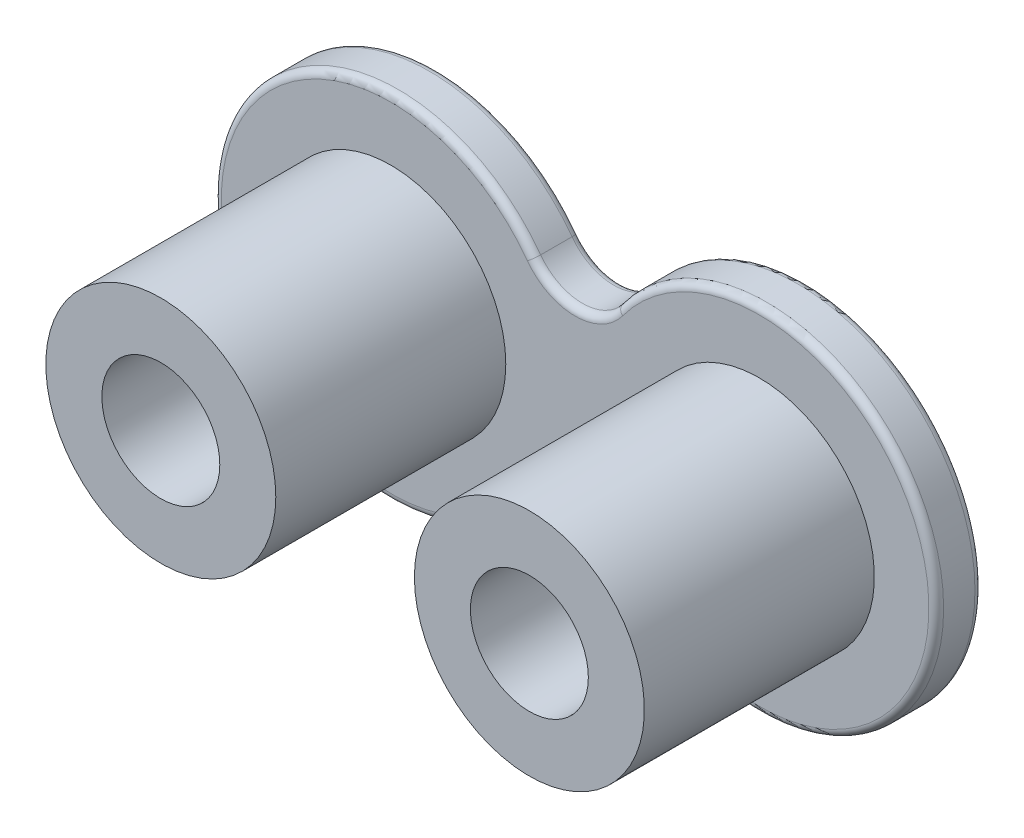
ISO-10303-21;
HEADER;
FILE_DESCRIPTION(('STEP AP214'),'2;1');
FILE_NAME('part.step','',(''),(''),'','','');
FILE_SCHEMA(('AUTOMOTIVE_DESIGN { 1 0 10303 214 1 1 1 1 }'));
ENDSEC;
DATA;
#1=APPLICATION_CONTEXT('core data for automotive mechanical design processes');
#2=APPLICATION_PROTOCOL_DEFINITION('international standard','automotive_design',2000,#1);
#3=PRODUCT_CONTEXT('',#1,'mechanical');
#4=PRODUCT('Part','Part','',(#3));
#5=PRODUCT_RELATED_PRODUCT_CATEGORY('part','',(#4));
#6=PRODUCT_DEFINITION_FORMATION('','',#4);
#7=PRODUCT_DEFINITION_CONTEXT('part definition',#1,'design');
#8=PRODUCT_DEFINITION('design','',#6,#7);
#9=PRODUCT_DEFINITION_SHAPE('','',#8);
#10=(LENGTH_UNIT() NAMED_UNIT(*) SI_UNIT(.MILLI.,.METRE.));
#11=(NAMED_UNIT(*) PLANE_ANGLE_UNIT() SI_UNIT($,.RADIAN.));
#12=(NAMED_UNIT(*) SI_UNIT($,.STERADIAN.) SOLID_ANGLE_UNIT());
#13=UNCERTAINTY_MEASURE_WITH_UNIT(LENGTH_MEASURE(1.E-05),#10,'distance_accuracy_value','');
#14=(GEOMETRIC_REPRESENTATION_CONTEXT(3) GLOBAL_UNCERTAINTY_ASSIGNED_CONTEXT((#13)) GLOBAL_UNIT_ASSIGNED_CONTEXT((#10,
#11,#12)) REPRESENTATION_CONTEXT('',''));
#15=CARTESIAN_POINT('',(0.,0.,0.));
#16=DIRECTION('',(0.,0.,1.));
#17=DIRECTION('',(1.,0.,0.));
#18=AXIS2_PLACEMENT_3D('',#15,#16,#17);
#19=CARTESIAN_POINT('',(3.175,2.33452988345001,1.5875));
#20=DIRECTION('',(0.,0.,1.));
#21=DIRECTION('',(1.,0.,0.));
#22=AXIS2_PLACEMENT_3D('',#19,#20,#21);
#23=PLANE('',#22);
#24=CARTESIAN_POINT('',(6.35,0.,1.5875));
#25=DIRECTION('',(0.,0.,1.));
#26=DIRECTION('',(-1.,0.,0.));
#27=AXIS2_PLACEMENT_3D('',#24,#25,#26);
#28=CIRCLE('',#27,3.9624);
#29=CARTESIAN_POINT('',(2.3876,0.,1.5875));
#30=VERTEX_POINT('',#29);
#31=EDGE_CURVE('E236',#30,#30,#28,.T.);
#32=ORIENTED_EDGE('',*,*,#31,.F.);
#33=EDGE_LOOP('',(#32));
#34=FACE_BOUND('',#33,.T.);
#35=CARTESIAN_POINT('',(-6.35,0.,1.5875));
#36=DIRECTION('',(0.,0.,1.));
#37=DIRECTION('',(1.,0.,0.));
#38=AXIS2_PLACEMENT_3D('',#35,#36,#37);
#39=CIRCLE('',#38,3.9624);
#40=CARTESIAN_POINT('',(-2.3876,0.,1.5875));
#41=VERTEX_POINT('',#40);
#42=EDGE_CURVE('E224',#41,#41,#39,.T.);
#43=ORIENTED_EDGE('',*,*,#42,.F.);
#44=EDGE_LOOP('',(#43));
#45=FACE_BOUND('',#44,.T.);
#46=CARTESIAN_POINT('',(0.,-4.66905976690001,1.5875));
#47=DIRECTION('',(0.,0.,1.));
#48=DIRECTION('',(1.,0.,0.));
#49=AXIS2_PLACEMENT_3D('',#46,#47,#48);
#50=CIRCLE('',#49,2.03979034908214);
#51=CARTESIAN_POINT('',(-1.64336630930306,-3.46071716579043,1.5875));
#52=VERTEX_POINT('',#51);
#53=CARTESIAN_POINT('',(1.64336630930306,-3.46071716579043,1.5875));
#54=VERTEX_POINT('',#53);
#55=EDGE_CURVE('E50',#52,#54,#50,.F.);
#56=ORIENTED_EDGE('',*,*,#55,.T.);
#57=CARTESIAN_POINT('',(6.35,0.,1.5875));
#58=DIRECTION('',(0.,0.,1.));
#59=DIRECTION('',(1.,0.,0.));
#60=AXIS2_PLACEMENT_3D('',#57,#58,#59);
#61=CIRCLE('',#60,5.842);
#62=CARTESIAN_POINT('',(1.64336630930306,3.46071716579042,1.5875));
#63=VERTEX_POINT('',#62);
#64=EDGE_CURVE('E42',#54,#63,#61,.T.);
#65=ORIENTED_EDGE('',*,*,#64,.T.);
#66=CARTESIAN_POINT('',(0.,4.66905976690001,1.5875));
#67=DIRECTION('',(0.,0.,1.));
#68=DIRECTION('',(1.,0.,0.));
#69=AXIS2_PLACEMENT_3D('',#66,#67,#68);
#70=CIRCLE('',#69,2.03979034908214);
#71=CARTESIAN_POINT('',(-1.64336630930306,3.46071716579042,1.5875));
#72=VERTEX_POINT('',#71);
#73=EDGE_CURVE('E168',#63,#72,#70,.F.);
#74=ORIENTED_EDGE('',*,*,#73,.T.);
#75=CARTESIAN_POINT('',(-6.35,0.,1.5875));
#76=DIRECTION('',(0.,0.,1.));
#77=DIRECTION('',(1.,0.,0.));
#78=AXIS2_PLACEMENT_3D('',#75,#76,#77);
#79=CIRCLE('',#78,5.842);
#80=EDGE_CURVE('E55',#72,#52,#79,.T.);
#81=ORIENTED_EDGE('',*,*,#80,.T.);
#82=EDGE_LOOP('',(#56,#65,#74,#81));
#83=FACE_BOUND('',#82,.T.);
#84=ADVANCED_FACE('F33',(#34,#45,#83),#23,.T.);
#85=CARTESIAN_POINT('',(3.175,2.33452988345001,0.));
#86=DIRECTION('',(0.,0.,1.));
#87=DIRECTION('',(1.,0.,0.));
#88=AXIS2_PLACEMENT_3D('',#85,#86,#87);
#89=PLANE('',#88);
#90=CARTESIAN_POINT('',(6.35,0.,0.));
#91=DIRECTION('',(0.,0.,1.));
#92=DIRECTION('',(1.,0.,0.));
#93=AXIS2_PLACEMENT_3D('',#90,#91,#92);
#94=CIRCLE('',#93,2.286);
#95=CARTESIAN_POINT('',(8.636,0.,0.));
#96=VERTEX_POINT('',#95);
#97=EDGE_CURVE('E130',#96,#96,#94,.T.);
#98=ORIENTED_EDGE('',*,*,#97,.T.);
#99=EDGE_LOOP('',(#98));
#100=FACE_BOUND('',#99,.T.);
#101=CARTESIAN_POINT('',(-6.35,0.,0.));
#102=DIRECTION('',(0.,0.,1.));
#103=DIRECTION('',(1.,0.,0.));
#104=AXIS2_PLACEMENT_3D('',#101,#102,#103);
#105=CIRCLE('',#104,2.286);
#106=CARTESIAN_POINT('',(-4.064,0.,0.));
#107=VERTEX_POINT('',#106);
#108=EDGE_CURVE('E127',#107,#107,#105,.T.);
#109=ORIENTED_EDGE('',*,*,#108,.T.);
#110=EDGE_LOOP('',(#109));
#111=FACE_BOUND('',#110,.T.);
#112=CARTESIAN_POINT('',(0.,-4.66905976690001,0.));
#113=DIRECTION('',(0.,0.,1.));
#114=DIRECTION('',(1.,0.,0.));
#115=AXIS2_PLACEMENT_3D('',#112,#113,#114);
#116=CIRCLE('',#115,2.03979034908214);
#117=CARTESIAN_POINT('',(1.64336630930306,-3.46071716579043,0.));
#118=VERTEX_POINT('',#117);
#119=CARTESIAN_POINT('',(-1.64336630930306,-3.46071716579043,0.));
#120=VERTEX_POINT('',#119);
#121=EDGE_CURVE('E126',#118,#120,#116,.T.);
#122=ORIENTED_EDGE('',*,*,#121,.T.);
#123=CARTESIAN_POINT('',(-6.35,0.,0.));
#124=DIRECTION('',(0.,0.,1.));
#125=DIRECTION('',(1.,0.,0.));
#126=AXIS2_PLACEMENT_3D('',#123,#124,#125);
#127=CIRCLE('',#126,5.842);
#128=CARTESIAN_POINT('',(-1.64336630930306,3.46071716579042,0.));
#129=VERTEX_POINT('',#128);
#130=EDGE_CURVE('E105',#120,#129,#127,.F.);
#131=ORIENTED_EDGE('',*,*,#130,.T.);
#132=CARTESIAN_POINT('',(0.,4.66905976690001,0.));
#133=DIRECTION('',(0.,0.,1.));
#134=DIRECTION('',(1.,0.,0.));
#135=AXIS2_PLACEMENT_3D('',#132,#133,#134);
#136=CIRCLE('',#135,2.03979034908214);
#137=CARTESIAN_POINT('',(1.64336630930306,3.46071716579042,0.));
#138=VERTEX_POINT('',#137);
#139=EDGE_CURVE('E115',#129,#138,#136,.T.);
#140=ORIENTED_EDGE('',*,*,#139,.T.);
#141=CARTESIAN_POINT('',(6.35,0.,0.));
#142=DIRECTION('',(0.,0.,1.));
#143=DIRECTION('',(1.,0.,0.));
#144=AXIS2_PLACEMENT_3D('',#141,#142,#143);
#145=CIRCLE('',#144,5.842);
#146=EDGE_CURVE('E121',#138,#118,#145,.F.);
#147=ORIENTED_EDGE('',*,*,#146,.T.);
#148=EDGE_LOOP('',(#122,#131,#140,#147));
#149=FACE_BOUND('',#148,.T.);
#150=ADVANCED_FACE('F124',(#100,#111,#149),#89,.F.);
#151=CARTESIAN_POINT('',(0.,4.66905976690001,1.5875));
#152=DIRECTION('',(0.,0.,-1.));
#153=DIRECTION('',(-1.,0.,0.));
#154=AXIS2_PLACEMENT_3D('',#151,#152,#153);
#155=CYLINDRICAL_SURFACE('',#154,1.78579034908214);
#156=DIRECTION('',(0.,0.,-1.));
#157=VECTOR('',#156,1.);
#158=CARTESIAN_POINT('',(1.43873006188146,3.61118312952044,1.5875));
#159=LINE('',#158,#157);
#160=CARTESIAN_POINT('',(1.43873006188146,3.61118312952044,1.3335));
#161=VERTEX_POINT('',#160);
#162=CARTESIAN_POINT('',(1.43873006188146,3.61118312952044,0.254));
#163=VERTEX_POINT('',#162);
#164=EDGE_CURVE('E177',#161,#163,#159,.T.);
#165=ORIENTED_EDGE('',*,*,#164,.T.);
#166=CARTESIAN_POINT('',(0.,4.66905976690001,0.254));
#167=DIRECTION('',(0.,0.,1.));
#168=DIRECTION('',(1.,0.,0.));
#169=AXIS2_PLACEMENT_3D('',#166,#167,#168);
#170=CIRCLE('',#169,1.78579034908214);
#171=CARTESIAN_POINT('',(-1.43873006188146,3.61118312952044,0.254));
#172=VERTEX_POINT('',#171);
#173=EDGE_CURVE('E163',#163,#172,#170,.F.);
#174=ORIENTED_EDGE('',*,*,#173,.T.);
#175=DIRECTION('',(0.,0.,-1.));
#176=VECTOR('',#175,1.);
#177=CARTESIAN_POINT('',(-1.43873006188146,3.61118312952044,1.5875));
#178=LINE('',#177,#176);
#179=CARTESIAN_POINT('',(-1.43873006188146,3.61118312952044,1.3335));
#180=VERTEX_POINT('',#179);
#181=EDGE_CURVE('E122',#180,#172,#178,.T.);
#182=ORIENTED_EDGE('',*,*,#181,.F.);
#183=CARTESIAN_POINT('',(0.,4.66905976690001,1.3335));
#184=DIRECTION('',(0.,0.,1.));
#185=DIRECTION('',(1.,0.,0.));
#186=AXIS2_PLACEMENT_3D('',#183,#184,#185);
#187=CIRCLE('',#186,1.78579034908214);
#188=EDGE_CURVE('E161',#180,#161,#187,.T.);
#189=ORIENTED_EDGE('',*,*,#188,.T.);
#190=EDGE_LOOP('',(#165,#174,#182,#189));
#191=FACE_BOUND('',#190,.T.);
#192=ADVANCED_FACE('F204',(#191),#155,.F.);
#193=CARTESIAN_POINT('',(-6.35,0.,1.5875));
#194=DIRECTION('',(0.,0.,-1.));
#195=DIRECTION('',(-1.,0.,0.));
#196=AXIS2_PLACEMENT_3D('',#193,#194,#195);
#197=CYLINDRICAL_SURFACE('',#196,6.096);
#198=ORIENTED_EDGE('',*,*,#181,.T.);
#199=CARTESIAN_POINT('',(-6.35,0.,0.254));
#200=DIRECTION('',(0.,0.,1.));
#201=DIRECTION('',(1.,0.,0.));
#202=AXIS2_PLACEMENT_3D('',#199,#200,#201);
#203=CIRCLE('',#202,6.096);
#204=CARTESIAN_POINT('',(-1.43873006188146,-3.61118312952044,0.254));
#205=VERTEX_POINT('',#204);
#206=EDGE_CURVE('E108',#172,#205,#203,.T.);
#207=ORIENTED_EDGE('',*,*,#206,.T.);
#208=DIRECTION('',(0.,0.,-1.));
#209=VECTOR('',#208,1.);
#210=CARTESIAN_POINT('',(-1.43873006188146,-3.61118312952044,1.5875));
#211=LINE('',#210,#209);
#212=CARTESIAN_POINT('',(-1.43873006188146,-3.61118312952044,1.3335));
#213=VERTEX_POINT('',#212);
#214=EDGE_CURVE('E201',#213,#205,#211,.T.);
#215=ORIENTED_EDGE('',*,*,#214,.F.);
#216=CARTESIAN_POINT('',(-6.35,0.,1.3335));
#217=DIRECTION('',(0.,0.,1.));
#218=DIRECTION('',(1.,0.,0.));
#219=AXIS2_PLACEMENT_3D('',#216,#217,#218);
#220=CIRCLE('',#219,6.096);
#221=EDGE_CURVE('E149',#213,#180,#220,.F.);
#222=ORIENTED_EDGE('',*,*,#221,.T.);
#223=EDGE_LOOP('',(#198,#207,#215,#222));
#224=FACE_BOUND('',#223,.T.);
#225=ADVANCED_FACE('F199',(#224),#197,.T.);
#226=CARTESIAN_POINT('',(0.,-4.66905976690001,1.5875));
#227=DIRECTION('',(0.,0.,-1.));
#228=DIRECTION('',(-1.,0.,0.));
#229=AXIS2_PLACEMENT_3D('',#226,#227,#228);
#230=CYLINDRICAL_SURFACE('',#229,1.78579034908214);
#231=ORIENTED_EDGE('',*,*,#214,.T.);
#232=CARTESIAN_POINT('',(0.,-4.66905976690001,0.254));
#233=DIRECTION('',(0.,0.,1.));
#234=DIRECTION('',(1.,0.,0.));
#235=AXIS2_PLACEMENT_3D('',#232,#233,#234);
#236=CIRCLE('',#235,1.78579034908214);
#237=CARTESIAN_POINT('',(1.43873006188146,-3.61118312952044,0.254));
#238=VERTEX_POINT('',#237);
#239=EDGE_CURVE('E154',#205,#238,#236,.F.);
#240=ORIENTED_EDGE('',*,*,#239,.T.);
#241=DIRECTION('',(0.,0.,-1.));
#242=VECTOR('',#241,1.);
#243=CARTESIAN_POINT('',(1.43873006188146,-3.61118312952044,1.5875));
#244=LINE('',#243,#242);
#245=CARTESIAN_POINT('',(1.43873006188146,-3.61118312952044,1.3335));
#246=VERTEX_POINT('',#245);
#247=EDGE_CURVE('E207',#246,#238,#244,.T.);
#248=ORIENTED_EDGE('',*,*,#247,.F.);
#249=CARTESIAN_POINT('',(0.,-4.66905976690001,1.3335));
#250=DIRECTION('',(0.,0.,1.));
#251=DIRECTION('',(1.,0.,0.));
#252=AXIS2_PLACEMENT_3D('',#249,#250,#251);
#253=CIRCLE('',#252,1.78579034908214);
#254=EDGE_CURVE('E152',#246,#213,#253,.T.);
#255=ORIENTED_EDGE('',*,*,#254,.T.);
#256=EDGE_LOOP('',(#231,#240,#248,#255));
#257=FACE_BOUND('',#256,.T.);
#258=ADVANCED_FACE('F220',(#257),#230,.F.);
#259=CARTESIAN_POINT('',(6.35,0.,1.5875));
#260=DIRECTION('',(0.,0.,-1.));
#261=DIRECTION('',(-1.,0.,0.));
#262=AXIS2_PLACEMENT_3D('',#259,#260,#261);
#263=CYLINDRICAL_SURFACE('',#262,6.096);
#264=ORIENTED_EDGE('',*,*,#247,.T.);
#265=CARTESIAN_POINT('',(6.35,0.,0.254));
#266=DIRECTION('',(0.,0.,1.));
#267=DIRECTION('',(1.,0.,0.));
#268=AXIS2_PLACEMENT_3D('',#265,#266,#267);
#269=CIRCLE('',#268,6.096);
#270=EDGE_CURVE('E159',#238,#163,#269,.T.);
#271=ORIENTED_EDGE('',*,*,#270,.T.);
#272=ORIENTED_EDGE('',*,*,#164,.F.);
#273=CARTESIAN_POINT('',(6.35,0.,1.3335));
#274=DIRECTION('',(0.,0.,1.));
#275=DIRECTION('',(1.,0.,0.));
#276=AXIS2_PLACEMENT_3D('',#273,#274,#275);
#277=CIRCLE('',#276,6.096);
#278=EDGE_CURVE('E156',#161,#246,#277,.F.);
#279=ORIENTED_EDGE('',*,*,#278,.T.);
#280=EDGE_LOOP('',(#264,#271,#272,#279));
#281=FACE_BOUND('',#280,.T.);
#282=ADVANCED_FACE('F281',(#281),#263,.T.);
#283=CARTESIAN_POINT('',(-6.35,0.,1.5875));
#284=DIRECTION('',(0.,0.,-1.));
#285=DIRECTION('',(-1.,0.,0.));
#286=AXIS2_PLACEMENT_3D('',#283,#284,#285);
#287=CYLINDRICAL_SURFACE('',#286,2.032);
#288=CARTESIAN_POINT('',(-6.35,0.,0.254));
#289=DIRECTION('',(0.,0.,1.));
#290=DIRECTION('',(1.,0.,0.));
#291=AXIS2_PLACEMENT_3D('',#288,#289,#290);
#292=CIRCLE('',#291,2.032);
#293=CARTESIAN_POINT('',(-4.318,0.,0.254));
#294=VERTEX_POINT('',#293);
#295=EDGE_CURVE('E146',#294,#294,#292,.F.);
#296=ORIENTED_EDGE('',*,*,#295,.T.);
#297=EDGE_LOOP('',(#296));
#298=FACE_BOUND('',#297,.T.);
#299=CARTESIAN_POINT('',(-6.35,0.,1.3335));
#300=DIRECTION('',(0.,0.,1.));
#301=DIRECTION('',(1.,0.,0.));
#302=AXIS2_PLACEMENT_3D('',#299,#300,#301);
#303=CIRCLE('',#302,2.032);
#304=CARTESIAN_POINT('',(-4.318,0.,1.3335));
#305=VERTEX_POINT('',#304);
#306=EDGE_CURVE('E143',#305,#305,#303,.T.);
#307=ORIENTED_EDGE('',*,*,#306,.T.);
#308=EDGE_LOOP('',(#307));
#309=FACE_BOUND('',#308,.T.);
#310=ADVANCED_FACE('F278',(#298,#309),#287,.F.);
#311=CARTESIAN_POINT('',(6.35,0.,1.5875));
#312=DIRECTION('',(0.,0.,-1.));
#313=DIRECTION('',(-1.,0.,0.));
#314=AXIS2_PLACEMENT_3D('',#311,#312,#313);
#315=CYLINDRICAL_SURFACE('',#314,2.032);
#316=CARTESIAN_POINT('',(6.35,0.,0.254));
#317=DIRECTION('',(0.,0.,1.));
#318=DIRECTION('',(1.,0.,0.));
#319=AXIS2_PLACEMENT_3D('',#316,#317,#318);
#320=CIRCLE('',#319,2.032);
#321=CARTESIAN_POINT('',(8.382,0.,0.254));
#322=VERTEX_POINT('',#321);
#323=EDGE_CURVE('E140',#322,#322,#320,.F.);
#324=ORIENTED_EDGE('',*,*,#323,.T.);
#325=EDGE_LOOP('',(#324));
#326=FACE_BOUND('',#325,.T.);
#327=CARTESIAN_POINT('',(6.35,0.,1.3335));
#328=DIRECTION('',(0.,0.,1.));
#329=DIRECTION('',(1.,0.,0.));
#330=AXIS2_PLACEMENT_3D('',#327,#328,#329);
#331=CIRCLE('',#330,2.032);
#332=CARTESIAN_POINT('',(8.382,0.,1.3335));
#333=VERTEX_POINT('',#332);
#334=EDGE_CURVE('E137',#333,#333,#331,.T.);
#335=ORIENTED_EDGE('',*,*,#334,.T.);
#336=EDGE_LOOP('',(#335));
#337=FACE_BOUND('',#336,.T.);
#338=ADVANCED_FACE('F294',(#326,#337),#315,.F.);
#339=CARTESIAN_POINT('',(6.35,0.,0.254));
#340=DIRECTION('',(0.,0.,1.));
#341=DIRECTION('',(1.,0.,0.));
#342=AXIS2_PLACEMENT_3D('',#339,#340,#341);
#343=TOROIDAL_SURFACE('',#342,2.286,0.254);
#344=ORIENTED_EDGE('',*,*,#323,.F.);
#345=EDGE_LOOP('',(#344));
#346=FACE_BOUND('',#345,.T.);
#347=ORIENTED_EDGE('',*,*,#97,.F.);
#348=EDGE_LOOP('',(#347));
#349=FACE_BOUND('',#348,.T.);
#350=ADVANCED_FACE('F290',(#346,#349),#343,.T.);
#351=CARTESIAN_POINT('',(-6.35,0.,0.254));
#352=DIRECTION('',(0.,0.,1.));
#353=DIRECTION('',(1.,0.,0.));
#354=AXIS2_PLACEMENT_3D('',#351,#352,#353);
#355=TOROIDAL_SURFACE('',#354,2.286,0.254);
#356=ORIENTED_EDGE('',*,*,#295,.F.);
#357=EDGE_LOOP('',(#356));
#358=FACE_BOUND('',#357,.T.);
#359=ORIENTED_EDGE('',*,*,#108,.F.);
#360=EDGE_LOOP('',(#359));
#361=FACE_BOUND('',#360,.T.);
#362=ADVANCED_FACE('F293',(#358,#361),#355,.T.);
#363=CARTESIAN_POINT('',(6.35,0.,0.254));
#364=DIRECTION('',(0.,0.,1.));
#365=DIRECTION('',(1.,0.,0.));
#366=AXIS2_PLACEMENT_3D('',#363,#364,#365);
#367=TOROIDAL_SURFACE('',#366,5.842,0.254);
#368=CARTESIAN_POINT('',(1.64336630930306,-3.46071716579043,0.254));
#369=DIRECTION('',(-0.59238568397645,0.805654517407898,0.));
#370=DIRECTION('',(-0.805654517407898,-0.59238568397645,0.));
#371=AXIS2_PLACEMENT_3D('',#368,#369,#370);
#372=CIRCLE('',#371,0.254);
#373=EDGE_CURVE('E111',#118,#238,#372,.T.);
#374=ORIENTED_EDGE('',*,*,#373,.F.);
#375=ORIENTED_EDGE('',*,*,#146,.F.);
#376=CARTESIAN_POINT('',(1.64336630930306,3.46071716579042,0.254));
#377=DIRECTION('',(-0.59238568397645,-0.805654517407898,0.));
#378=DIRECTION('',(0.805654517407898,-0.59238568397645,0.));
#379=AXIS2_PLACEMENT_3D('',#376,#377,#378);
#380=CIRCLE('',#379,0.254);
#381=EDGE_CURVE('E118',#163,#138,#380,.T.);
#382=ORIENTED_EDGE('',*,*,#381,.F.);
#383=ORIENTED_EDGE('',*,*,#270,.F.);
#384=EDGE_LOOP('',(#374,#375,#382,#383));
#385=FACE_BOUND('',#384,.T.);
#386=ADVANCED_FACE('F213',(#385),#367,.T.);
#387=CARTESIAN_POINT('',(0.,4.66905976690001,0.254));
#388=DIRECTION('',(0.,0.,1.));
#389=DIRECTION('',(1.,0.,0.));
#390=AXIS2_PLACEMENT_3D('',#387,#388,#389);
#391=TOROIDAL_SURFACE('',#390,2.03979034908214,0.254);
#392=ORIENTED_EDGE('',*,*,#381,.T.);
#393=ORIENTED_EDGE('',*,*,#139,.F.);
#394=CARTESIAN_POINT('',(-1.64336630930306,3.46071716579042,0.254));
#395=DIRECTION('',(-0.59238568397645,0.805654517407898,0.));
#396=DIRECTION('',(-0.805654517407898,-0.59238568397645,0.));
#397=AXIS2_PLACEMENT_3D('',#394,#395,#396);
#398=CIRCLE('',#397,0.254);
#399=EDGE_CURVE('E101',#172,#129,#398,.T.);
#400=ORIENTED_EDGE('',*,*,#399,.F.);
#401=ORIENTED_EDGE('',*,*,#173,.F.);
#402=EDGE_LOOP('',(#392,#393,#400,#401));
#403=FACE_BOUND('',#402,.T.);
#404=ADVANCED_FACE('F116',(#403),#391,.T.);
#405=CARTESIAN_POINT('',(0.,-4.66905976690001,0.254));
#406=DIRECTION('',(0.,0.,1.));
#407=DIRECTION('',(1.,0.,0.));
#408=AXIS2_PLACEMENT_3D('',#405,#406,#407);
#409=TOROIDAL_SURFACE('',#408,2.03979034908214,0.254);
#410=ORIENTED_EDGE('',*,*,#373,.T.);
#411=ORIENTED_EDGE('',*,*,#239,.F.);
#412=CARTESIAN_POINT('',(-1.64336630930306,-3.46071716579043,0.254));
#413=DIRECTION('',(-0.59238568397645,-0.805654517407898,0.));
#414=DIRECTION('',(0.805654517407898,-0.59238568397645,0.));
#415=AXIS2_PLACEMENT_3D('',#412,#413,#414);
#416=CIRCLE('',#415,0.254);
#417=EDGE_CURVE('E112',#120,#205,#416,.T.);
#418=ORIENTED_EDGE('',*,*,#417,.F.);
#419=ORIENTED_EDGE('',*,*,#121,.F.);
#420=EDGE_LOOP('',(#410,#411,#418,#419));
#421=FACE_BOUND('',#420,.T.);
#422=ADVANCED_FACE('F216',(#421),#409,.T.);
#423=CARTESIAN_POINT('',(-6.35,0.,0.254));
#424=DIRECTION('',(0.,0.,1.));
#425=DIRECTION('',(1.,0.,0.));
#426=AXIS2_PLACEMENT_3D('',#423,#424,#425);
#427=TOROIDAL_SURFACE('',#426,5.842,0.254);
#428=ORIENTED_EDGE('',*,*,#399,.T.);
#429=ORIENTED_EDGE('',*,*,#130,.F.);
#430=ORIENTED_EDGE('',*,*,#417,.T.);
#431=ORIENTED_EDGE('',*,*,#206,.F.);
#432=EDGE_LOOP('',(#428,#429,#430,#431));
#433=FACE_BOUND('',#432,.T.);
#434=ADVANCED_FACE('F103',(#433),#427,.T.);
#435=CARTESIAN_POINT('',(6.35,0.,1.3335));
#436=DIRECTION('',(0.,0.,1.));
#437=DIRECTION('',(1.,0.,0.));
#438=AXIS2_PLACEMENT_3D('',#435,#436,#437);
#439=TOROIDAL_SURFACE('',#438,2.286,0.254);
#440=CARTESIAN_POINT('',(6.35,0.,1.5875));
#441=DIRECTION('',(0.,0.,1.));
#442=DIRECTION('',(1.,0.,0.));
#443=AXIS2_PLACEMENT_3D('',#440,#441,#442);
#444=CIRCLE('',#443,2.286);
#445=CARTESIAN_POINT('',(8.636,0.,1.5875));
#446=VERTEX_POINT('',#445);
#447=EDGE_CURVE('E11',#446,#446,#444,.F.);
#448=ORIENTED_EDGE('',*,*,#447,.F.);
#449=EDGE_LOOP('',(#448));
#450=FACE_BOUND('',#449,.T.);
#451=ORIENTED_EDGE('',*,*,#334,.F.);
#452=EDGE_LOOP('',(#451));
#453=FACE_BOUND('',#452,.T.);
#454=ADVANCED_FACE('F301',(#450,#453),#439,.T.);
#455=CARTESIAN_POINT('',(-6.35,0.,1.3335));
#456=DIRECTION('',(0.,0.,1.));
#457=DIRECTION('',(1.,0.,0.));
#458=AXIS2_PLACEMENT_3D('',#455,#456,#457);
#459=TOROIDAL_SURFACE('',#458,5.842,0.254);
#460=CARTESIAN_POINT('',(-1.64336630930306,3.46071716579042,1.3335));
#461=DIRECTION('',(0.59238568397645,-0.805654517407898,0.));
#462=DIRECTION('',(0.805654517407898,0.59238568397645,0.));
#463=AXIS2_PLACEMENT_3D('',#460,#461,#462);
#464=CIRCLE('',#463,0.254);
#465=EDGE_CURVE('E182',#180,#72,#464,.T.);
#466=ORIENTED_EDGE('',*,*,#465,.F.);
#467=ORIENTED_EDGE('',*,*,#221,.F.);
#468=CARTESIAN_POINT('',(-1.64336630930306,-3.46071716579043,1.3335));
#469=DIRECTION('',(0.59238568397645,0.805654517407898,0.));
#470=DIRECTION('',(-0.805654517407898,0.59238568397645,0.));
#471=AXIS2_PLACEMENT_3D('',#468,#469,#470);
#472=CIRCLE('',#471,0.254);
#473=EDGE_CURVE('E37',#52,#213,#472,.T.);
#474=ORIENTED_EDGE('',*,*,#473,.F.);
#475=ORIENTED_EDGE('',*,*,#80,.F.);
#476=EDGE_LOOP('',(#466,#467,#474,#475));
#477=FACE_BOUND('',#476,.T.);
#478=ADVANCED_FACE('F194',(#477),#459,.T.);
#479=CARTESIAN_POINT('',(0.,-4.66905976690001,1.3335));
#480=DIRECTION('',(0.,0.,1.));
#481=DIRECTION('',(1.,0.,0.));
#482=AXIS2_PLACEMENT_3D('',#479,#480,#481);
#483=TOROIDAL_SURFACE('',#482,2.03979034908214,0.254);
#484=ORIENTED_EDGE('',*,*,#473,.T.);
#485=ORIENTED_EDGE('',*,*,#254,.F.);
#486=CARTESIAN_POINT('',(1.64336630930306,-3.46071716579043,1.3335));
#487=DIRECTION('',(0.59238568397645,-0.805654517407898,0.));
#488=DIRECTION('',(0.805654517407898,0.59238568397645,0.));
#489=AXIS2_PLACEMENT_3D('',#486,#487,#488);
#490=CIRCLE('',#489,0.254);
#491=EDGE_CURVE('E180',#54,#246,#490,.T.);
#492=ORIENTED_EDGE('',*,*,#491,.F.);
#493=ORIENTED_EDGE('',*,*,#55,.F.);
#494=EDGE_LOOP('',(#484,#485,#492,#493));
#495=FACE_BOUND('',#494,.T.);
#496=ADVANCED_FACE('F191',(#495),#483,.T.);
#497=CARTESIAN_POINT('',(0.,4.66905976690001,1.3335));
#498=DIRECTION('',(0.,0.,1.));
#499=DIRECTION('',(1.,0.,0.));
#500=AXIS2_PLACEMENT_3D('',#497,#498,#499);
#501=TOROIDAL_SURFACE('',#500,2.03979034908214,0.254);
#502=ORIENTED_EDGE('',*,*,#465,.T.);
#503=ORIENTED_EDGE('',*,*,#73,.F.);
#504=CARTESIAN_POINT('',(1.64336630930306,3.46071716579042,1.3335));
#505=DIRECTION('',(0.592385683976452,0.805654517407897,0.));
#506=DIRECTION('',(-0.805654517407897,0.592385683976452,0.));
#507=AXIS2_PLACEMENT_3D('',#504,#505,#506);
#508=CIRCLE('',#507,0.254);
#509=EDGE_CURVE('E178',#161,#63,#508,.T.);
#510=ORIENTED_EDGE('',*,*,#509,.F.);
#511=ORIENTED_EDGE('',*,*,#188,.F.);
#512=EDGE_LOOP('',(#502,#503,#510,#511));
#513=FACE_BOUND('',#512,.T.);
#514=ADVANCED_FACE('F314',(#513),#501,.T.);
#515=CARTESIAN_POINT('',(6.35,0.,1.3335));
#516=DIRECTION('',(0.,0.,1.));
#517=DIRECTION('',(1.,0.,0.));
#518=AXIS2_PLACEMENT_3D('',#515,#516,#517);
#519=TOROIDAL_SURFACE('',#518,5.842,0.254);
#520=ORIENTED_EDGE('',*,*,#491,.T.);
#521=ORIENTED_EDGE('',*,*,#278,.F.);
#522=ORIENTED_EDGE('',*,*,#509,.T.);
#523=ORIENTED_EDGE('',*,*,#64,.F.);
#524=EDGE_LOOP('',(#520,#521,#522,#523));
#525=FACE_BOUND('',#524,.T.);
#526=ADVANCED_FACE('F311',(#525),#519,.T.);
#527=CARTESIAN_POINT('',(-6.35,0.,1.3335));
#528=DIRECTION('',(0.,0.,1.));
#529=DIRECTION('',(1.,0.,0.));
#530=AXIS2_PLACEMENT_3D('',#527,#528,#529);
#531=TOROIDAL_SURFACE('',#530,2.286,0.254);
#532=CARTESIAN_POINT('',(-6.35,0.,1.5875));
#533=DIRECTION('',(0.,0.,1.));
#534=DIRECTION('',(1.,0.,0.));
#535=AXIS2_PLACEMENT_3D('',#532,#533,#534);
#536=CIRCLE('',#535,2.286);
#537=CARTESIAN_POINT('',(-4.064,0.,1.5875));
#538=VERTEX_POINT('',#537);
#539=EDGE_CURVE('E165',#538,#538,#536,.F.);
#540=ORIENTED_EDGE('',*,*,#539,.F.);
#541=EDGE_LOOP('',(#540));
#542=FACE_BOUND('',#541,.T.);
#543=ORIENTED_EDGE('',*,*,#306,.F.);
#544=EDGE_LOOP('',(#543));
#545=FACE_BOUND('',#544,.T.);
#546=ADVANCED_FACE('F35',(#542,#545),#531,.T.);
#547=CARTESIAN_POINT('',(-6.35,0.,1.5875));
#548=DIRECTION('',(0.,0.,1.));
#549=DIRECTION('',(1.,0.,0.));
#550=AXIS2_PLACEMENT_3D('',#547,#548,#549);
#551=PLANE('',#550);
#552=CARTESIAN_POINT('',(-6.35,0.,1.5875));
#553=DIRECTION('',(0.,0.,1.));
#554=DIRECTION('',(1.,0.,0.));
#555=AXIS2_PLACEMENT_3D('',#552,#553,#554);
#556=CIRCLE('',#555,2.032);
#557=CARTESIAN_POINT('',(-4.318,0.,1.5875));
#558=VERTEX_POINT('',#557);
#559=EDGE_CURVE('E230',#558,#558,#556,.T.);
#560=ORIENTED_EDGE('',*,*,#559,.T.);
#561=EDGE_LOOP('',(#560));
#562=FACE_BOUND('',#561,.T.);
#563=ORIENTED_EDGE('',*,*,#539,.T.);
#564=EDGE_LOOP('',(#563));
#565=FACE_BOUND('',#564,.T.);
#566=ADVANCED_FACE('F342',(#562,#565),#551,.F.);
#567=CARTESIAN_POINT('',(-6.35,0.,9.5123));
#568=DIRECTION('',(0.,0.,1.));
#569=DIRECTION('',(1.,0.,0.));
#570=AXIS2_PLACEMENT_3D('',#567,#568,#569);
#571=PLANE('',#570);
#572=CARTESIAN_POINT('',(-6.35,0.,9.5123));
#573=DIRECTION('',(0.,0.,1.));
#574=DIRECTION('',(1.,0.,0.));
#575=AXIS2_PLACEMENT_3D('',#572,#573,#574);
#576=CIRCLE('',#575,3.9624);
#577=CARTESIAN_POINT('',(-2.3876,0.,9.5123));
#578=VERTEX_POINT('',#577);
#579=EDGE_CURVE('E181',#578,#578,#576,.T.);
#580=ORIENTED_EDGE('',*,*,#579,.T.);
#581=EDGE_LOOP('',(#580));
#582=FACE_BOUND('',#581,.T.);
#583=CARTESIAN_POINT('',(-6.35,0.,9.5123));
#584=DIRECTION('',(0.,0.,1.));
#585=DIRECTION('',(1.,0.,0.));
#586=AXIS2_PLACEMENT_3D('',#583,#584,#585);
#587=CIRCLE('',#586,2.032);
#588=CARTESIAN_POINT('',(-4.318,0.,9.5123));
#589=VERTEX_POINT('',#588);
#590=EDGE_CURVE('E227',#589,#589,#587,.T.);
#591=ORIENTED_EDGE('',*,*,#590,.F.);
#592=EDGE_LOOP('',(#591));
#593=FACE_BOUND('',#592,.T.);
#594=ADVANCED_FACE('F349',(#582,#593),#571,.T.);
#595=CARTESIAN_POINT('',(-6.35,0.,9.5123));
#596=DIRECTION('',(0.,0.,-1.));
#597=DIRECTION('',(-1.,0.,0.));
#598=AXIS2_PLACEMENT_3D('',#595,#596,#597);
#599=CYLINDRICAL_SURFACE('',#598,3.9624);
#600=ORIENTED_EDGE('',*,*,#579,.F.);
#601=EDGE_LOOP('',(#600));
#602=FACE_BOUND('',#601,.T.);
#603=ORIENTED_EDGE('',*,*,#42,.T.);
#604=EDGE_LOOP('',(#603));
#605=FACE_BOUND('',#604,.T.);
#606=ADVANCED_FACE('F357',(#602,#605),#599,.T.);
#607=CARTESIAN_POINT('',(-6.35,0.,9.5123));
#608=DIRECTION('',(0.,0.,-1.));
#609=DIRECTION('',(-1.,0.,0.));
#610=AXIS2_PLACEMENT_3D('',#607,#608,#609);
#611=CYLINDRICAL_SURFACE('',#610,2.032);
#612=ORIENTED_EDGE('',*,*,#590,.T.);
#613=EDGE_LOOP('',(#612));
#614=FACE_BOUND('',#613,.T.);
#615=ORIENTED_EDGE('',*,*,#559,.F.);
#616=EDGE_LOOP('',(#615));
#617=FACE_BOUND('',#616,.T.);
#618=ADVANCED_FACE('F263',(#614,#617),#611,.F.);
#619=CARTESIAN_POINT('',(6.35,0.,1.5875));
#620=DIRECTION('',(0.,0.,-1.));
#621=DIRECTION('',(-1.,0.,0.));
#622=AXIS2_PLACEMENT_3D('',#619,#620,#621);
#623=PLANE('',#622);
#624=CARTESIAN_POINT('',(6.35,0.,1.5875));
#625=DIRECTION('',(0.,0.,1.));
#626=DIRECTION('',(1.,0.,0.));
#627=AXIS2_PLACEMENT_3D('',#624,#625,#626);
#628=CIRCLE('',#627,2.032);
#629=CARTESIAN_POINT('',(8.382,0.,1.5875));
#630=VERTEX_POINT('',#629);
#631=EDGE_CURVE('E242',#630,#630,#628,.T.);
#632=ORIENTED_EDGE('',*,*,#631,.T.);
#633=EDGE_LOOP('',(#632));
#634=FACE_BOUND('',#633,.T.);
#635=ORIENTED_EDGE('',*,*,#447,.T.);
#636=EDGE_LOOP('',(#635));
#637=FACE_BOUND('',#636,.T.);
#638=ADVANCED_FACE('F254',(#634,#637),#623,.T.);
#639=CARTESIAN_POINT('',(6.35,0.,9.5123));
#640=DIRECTION('',(0.,0.,-1.));
#641=DIRECTION('',(-1.,0.,0.));
#642=AXIS2_PLACEMENT_3D('',#639,#640,#641);
#643=PLANE('',#642);
#644=CARTESIAN_POINT('',(6.35,0.,9.5123));
#645=DIRECTION('',(0.,0.,1.));
#646=DIRECTION('',(-1.,0.,0.));
#647=AXIS2_PLACEMENT_3D('',#644,#645,#646);
#648=CIRCLE('',#647,3.9624);
#649=CARTESIAN_POINT('',(2.3876,0.,9.5123));
#650=VERTEX_POINT('',#649);
#651=EDGE_CURVE('E233',#650,#650,#648,.T.);
#652=ORIENTED_EDGE('',*,*,#651,.T.);
#653=EDGE_LOOP('',(#652));
#654=FACE_BOUND('',#653,.T.);
#655=CARTESIAN_POINT('',(6.35,0.,9.5123));
#656=DIRECTION('',(0.,0.,1.));
#657=DIRECTION('',(1.,0.,0.));
#658=AXIS2_PLACEMENT_3D('',#655,#656,#657);
#659=CIRCLE('',#658,2.032);
#660=CARTESIAN_POINT('',(8.382,0.,9.5123));
#661=VERTEX_POINT('',#660);
#662=EDGE_CURVE('E239',#661,#661,#659,.T.);
#663=ORIENTED_EDGE('',*,*,#662,.F.);
#664=EDGE_LOOP('',(#663));
#665=FACE_BOUND('',#664,.T.);
#666=ADVANCED_FACE('F251',(#654,#665),#643,.F.);
#667=CARTESIAN_POINT('',(6.35,0.,9.5123));
#668=DIRECTION('',(0.,0.,-1.));
#669=DIRECTION('',(-1.,0.,0.));
#670=AXIS2_PLACEMENT_3D('',#667,#668,#669);
#671=CYLINDRICAL_SURFACE('',#670,3.9624);
#672=ORIENTED_EDGE('',*,*,#651,.F.);
#673=EDGE_LOOP('',(#672));
#674=FACE_BOUND('',#673,.T.);
#675=ORIENTED_EDGE('',*,*,#31,.T.);
#676=EDGE_LOOP('',(#675));
#677=FACE_BOUND('',#676,.T.);
#678=ADVANCED_FACE('F253',(#674,#677),#671,.T.);
#679=CARTESIAN_POINT('',(6.35,0.,9.5123));
#680=DIRECTION('',(0.,0.,-1.));
#681=DIRECTION('',(-1.,0.,0.));
#682=AXIS2_PLACEMENT_3D('',#679,#680,#681);
#683=CYLINDRICAL_SURFACE('',#682,2.032);
#684=ORIENTED_EDGE('',*,*,#662,.T.);
#685=EDGE_LOOP('',(#684));
#686=FACE_BOUND('',#685,.T.);
#687=ORIENTED_EDGE('',*,*,#631,.F.);
#688=EDGE_LOOP('',(#687));
#689=FACE_BOUND('',#688,.T.);
#690=ADVANCED_FACE('F248',(#686,#689),#683,.F.);
#691=CLOSED_SHELL('',(#84,#150,#192,#225,#258,#282,#310,#338,#350,#362,#386,#404,#422,#434,#454,
#478,#496,#514,#526,#546,#566,#594,#606,#618,#638,#666,#678,#690));
#692=MANIFOLD_SOLID_BREP('B2',#691);
#693=ADVANCED_BREP_SHAPE_REPRESENTATION('',(#18,#692),#14);
#694=SHAPE_DEFINITION_REPRESENTATION(#9,#693);
ENDSEC;
END-ISO-10303-21;
